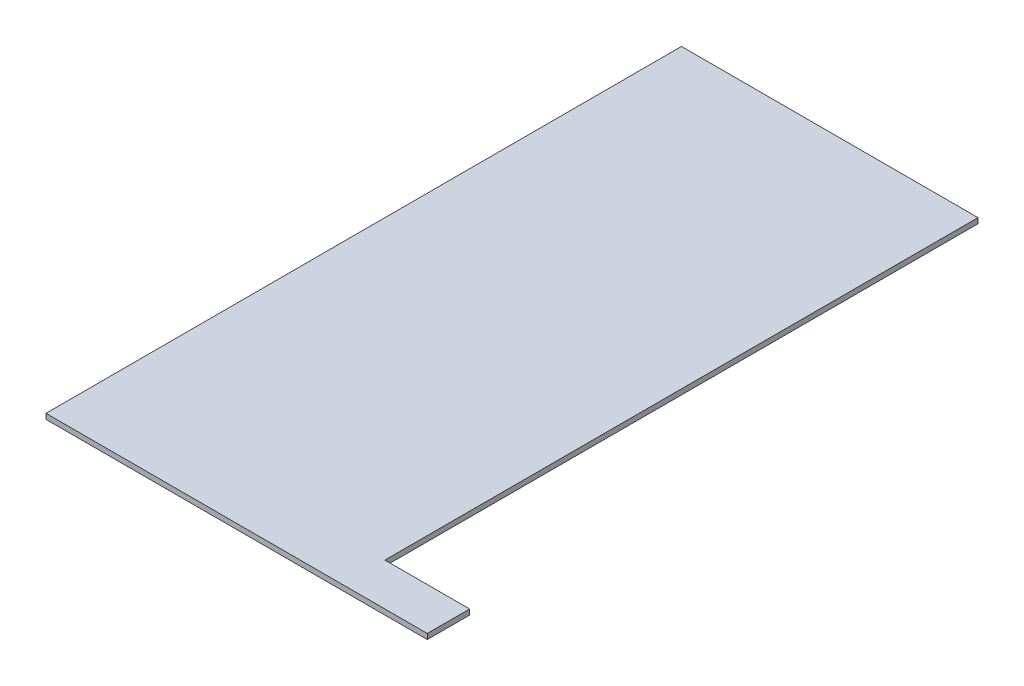
ISO-10303-21;
HEADER;
FILE_DESCRIPTION(('STEP AP214'),'2;1');
FILE_NAME('part.step','',(''),(''),'','','');
FILE_SCHEMA(('AUTOMOTIVE_DESIGN { 1 0 10303 214 1 1 1 1 }'));
ENDSEC;
DATA;
#1=APPLICATION_CONTEXT('core data for automotive mechanical design processes');
#2=APPLICATION_PROTOCOL_DEFINITION('international standard','automotive_design',2000,#1);
#3=PRODUCT_CONTEXT('',#1,'mechanical');
#4=PRODUCT('Part','Part','',(#3));
#5=PRODUCT_RELATED_PRODUCT_CATEGORY('part','',(#4));
#6=PRODUCT_DEFINITION_FORMATION('','',#4);
#7=PRODUCT_DEFINITION_CONTEXT('part definition',#1,'design');
#8=PRODUCT_DEFINITION('design','',#6,#7);
#9=PRODUCT_DEFINITION_SHAPE('','',#8);
#10=(LENGTH_UNIT() NAMED_UNIT(*) SI_UNIT(.MILLI.,.METRE.));
#11=(NAMED_UNIT(*) PLANE_ANGLE_UNIT() SI_UNIT($,.RADIAN.));
#12=(NAMED_UNIT(*) SI_UNIT($,.STERADIAN.) SOLID_ANGLE_UNIT());
#13=UNCERTAINTY_MEASURE_WITH_UNIT(LENGTH_MEASURE(1.E-05),#10,'distance_accuracy_value','');
#14=(GEOMETRIC_REPRESENTATION_CONTEXT(3) GLOBAL_UNCERTAINTY_ASSIGNED_CONTEXT((#13)) GLOBAL_UNIT_ASSIGNED_CONTEXT((#10,
#11,#12)) REPRESENTATION_CONTEXT('',''));
#15=CARTESIAN_POINT('',(0.,0.,0.));
#16=DIRECTION('',(0.,0.,1.));
#17=DIRECTION('',(1.,0.,0.));
#18=AXIS2_PLACEMENT_3D('',#15,#16,#17);
#19=CARTESIAN_POINT('',(44.45,1.5875,0.));
#20=DIRECTION('',(1.,0.,0.));
#21=DIRECTION('',(0.,0.,-1.));
#22=AXIS2_PLACEMENT_3D('',#19,#20,#21);
#23=PLANE('',#22);
#24=DIRECTION('',(0.,0.,1.));
#25=VECTOR('',#24,1.);
#26=CARTESIAN_POINT('',(44.45,0.,0.));
#27=LINE('',#26,#25);
#28=CARTESIAN_POINT('',(44.45,0.,-95.25));
#29=VERTEX_POINT('',#28);
#30=CARTESIAN_POINT('',(44.45,0.,82.55));
#31=VERTEX_POINT('',#30);
#32=EDGE_CURVE('E132',#29,#31,#27,.T.);
#33=ORIENTED_EDGE('',*,*,#32,.F.);
#34=DIRECTION('',(0.,-1.,0.));
#35=VECTOR('',#34,1.);
#36=CARTESIAN_POINT('',(44.45,1.5875,-95.25));
#37=LINE('',#36,#35);
#38=CARTESIAN_POINT('',(44.45,1.5875,-95.25));
#39=VERTEX_POINT('',#38);
#40=EDGE_CURVE('E11',#39,#29,#37,.T.);
#41=ORIENTED_EDGE('',*,*,#40,.F.);
#42=DIRECTION('',(0.,0.,1.));
#43=VECTOR('',#42,1.);
#44=CARTESIAN_POINT('',(44.45,1.5875,0.));
#45=LINE('',#44,#43);
#46=CARTESIAN_POINT('',(44.45,1.5875,82.55));
#47=VERTEX_POINT('',#46);
#48=EDGE_CURVE('E151',#39,#47,#45,.T.);
#49=ORIENTED_EDGE('',*,*,#48,.T.);
#50=DIRECTION('',(0.,-1.,0.));
#51=VECTOR('',#50,1.);
#52=CARTESIAN_POINT('',(44.45,1.5875,82.55));
#53=LINE('',#52,#51);
#54=EDGE_CURVE('E62',#47,#31,#53,.T.);
#55=ORIENTED_EDGE('',*,*,#54,.T.);
#56=EDGE_LOOP('',(#33,#41,#49,#55));
#57=FACE_BOUND('',#56,.T.);
#58=ADVANCED_FACE('F45',(#57),#23,.T.);
#59=CARTESIAN_POINT('',(0.,1.5875,-95.25));
#60=DIRECTION('',(0.,0.,-1.));
#61=DIRECTION('',(-1.,0.,0.));
#62=AXIS2_PLACEMENT_3D('',#59,#60,#61);
#63=PLANE('',#62);
#64=DIRECTION('',(1.,0.,0.));
#65=VECTOR('',#64,1.);
#66=CARTESIAN_POINT('',(0.,0.,-95.25));
#67=LINE('',#66,#65);
#68=CARTESIAN_POINT('',(-44.45,0.,-95.25));
#69=VERTEX_POINT('',#68);
#70=EDGE_CURVE('E135',#69,#29,#67,.T.);
#71=ORIENTED_EDGE('',*,*,#70,.F.);
#72=DIRECTION('',(0.,-1.,0.));
#73=VECTOR('',#72,1.);
#74=CARTESIAN_POINT('',(-44.45,1.5875,-95.25));
#75=LINE('',#74,#73);
#76=CARTESIAN_POINT('',(-44.45,1.5875,-95.25));
#77=VERTEX_POINT('',#76);
#78=EDGE_CURVE('E54',#77,#69,#75,.T.);
#79=ORIENTED_EDGE('',*,*,#78,.F.);
#80=DIRECTION('',(1.,0.,0.));
#81=VECTOR('',#80,1.);
#82=CARTESIAN_POINT('',(0.,1.5875,-95.25));
#83=LINE('',#82,#81);
#84=EDGE_CURVE('E167',#77,#39,#83,.T.);
#85=ORIENTED_EDGE('',*,*,#84,.T.);
#86=ORIENTED_EDGE('',*,*,#40,.T.);
#87=EDGE_LOOP('',(#71,#79,#85,#86));
#88=FACE_BOUND('',#87,.T.);
#89=ADVANCED_FACE('F166',(#88),#63,.T.);
#90=CARTESIAN_POINT('',(-44.45,1.5875,0.));
#91=DIRECTION('',(1.,0.,0.));
#92=DIRECTION('',(0.,0.,-1.));
#93=AXIS2_PLACEMENT_3D('',#90,#91,#92);
#94=PLANE('',#93);
#95=DIRECTION('',(0.,0.,1.));
#96=VECTOR('',#95,1.);
#97=CARTESIAN_POINT('',(-44.45,0.,0.));
#98=LINE('',#97,#96);
#99=CARTESIAN_POINT('',(-44.45,0.,95.25));
#100=VERTEX_POINT('',#99);
#101=EDGE_CURVE('E139',#69,#100,#98,.T.);
#102=ORIENTED_EDGE('',*,*,#101,.T.);
#103=DIRECTION('',(0.,-1.,0.));
#104=VECTOR('',#103,1.);
#105=CARTESIAN_POINT('',(-44.45,1.5875,95.25));
#106=LINE('',#105,#104);
#107=CARTESIAN_POINT('',(-44.45,1.5875,95.25));
#108=VERTEX_POINT('',#107);
#109=EDGE_CURVE('E122',#108,#100,#106,.T.);
#110=ORIENTED_EDGE('',*,*,#109,.F.);
#111=DIRECTION('',(0.,0.,1.));
#112=VECTOR('',#111,1.);
#113=CARTESIAN_POINT('',(-44.45,1.5875,0.));
#114=LINE('',#113,#112);
#115=EDGE_CURVE('E108',#77,#108,#114,.T.);
#116=ORIENTED_EDGE('',*,*,#115,.F.);
#117=ORIENTED_EDGE('',*,*,#78,.T.);
#118=EDGE_LOOP('',(#102,#110,#116,#117));
#119=FACE_BOUND('',#118,.T.);
#120=ADVANCED_FACE('F160',(#119),#94,.F.);
#121=CARTESIAN_POINT('',(0.,1.5875,95.25));
#122=DIRECTION('',(0.,0.,-1.));
#123=DIRECTION('',(-1.,0.,0.));
#124=AXIS2_PLACEMENT_3D('',#121,#122,#123);
#125=PLANE('',#124);
#126=DIRECTION('',(1.,0.,0.));
#127=VECTOR('',#126,1.);
#128=CARTESIAN_POINT('',(0.,0.,95.25));
#129=LINE('',#128,#127);
#130=CARTESIAN_POINT('',(69.85,0.,95.25));
#131=VERTEX_POINT('',#130);
#132=EDGE_CURVE('E118',#100,#131,#129,.T.);
#133=ORIENTED_EDGE('',*,*,#132,.T.);
#134=DIRECTION('',(0.,-1.,0.));
#135=VECTOR('',#134,1.);
#136=CARTESIAN_POINT('',(69.85,1.5875,95.25));
#137=LINE('',#136,#135);
#138=CARTESIAN_POINT('',(69.85,1.5875,95.25));
#139=VERTEX_POINT('',#138);
#140=EDGE_CURVE('E115',#139,#131,#137,.T.);
#141=ORIENTED_EDGE('',*,*,#140,.F.);
#142=DIRECTION('',(1.,0.,0.));
#143=VECTOR('',#142,1.);
#144=CARTESIAN_POINT('',(0.,1.5875,95.25));
#145=LINE('',#144,#143);
#146=EDGE_CURVE('E100',#108,#139,#145,.T.);
#147=ORIENTED_EDGE('',*,*,#146,.F.);
#148=ORIENTED_EDGE('',*,*,#109,.T.);
#149=EDGE_LOOP('',(#133,#141,#147,#148));
#150=FACE_BOUND('',#149,.T.);
#151=ADVANCED_FACE('F116',(#150),#125,.F.);
#152=CARTESIAN_POINT('',(69.8499999999999,1.5875,0.));
#153=DIRECTION('',(-1.,0.,0.));
#154=DIRECTION('',(0.,0.,1.));
#155=AXIS2_PLACEMENT_3D('',#152,#153,#154);
#156=PLANE('',#155);
#157=DIRECTION('',(0.,0.,-1.));
#158=VECTOR('',#157,1.);
#159=CARTESIAN_POINT('',(69.8499999999999,0.,0.));
#160=LINE('',#159,#158);
#161=CARTESIAN_POINT('',(69.85,0.,82.55));
#162=VERTEX_POINT('',#161);
#163=EDGE_CURVE('E144',#131,#162,#160,.T.);
#164=ORIENTED_EDGE('',*,*,#163,.T.);
#165=DIRECTION('',(0.,-1.,0.));
#166=VECTOR('',#165,1.);
#167=CARTESIAN_POINT('',(69.85,1.5875,82.55));
#168=LINE('',#167,#166);
#169=CARTESIAN_POINT('',(69.85,1.5875,82.55));
#170=VERTEX_POINT('',#169);
#171=EDGE_CURVE('E82',#170,#162,#168,.T.);
#172=ORIENTED_EDGE('',*,*,#171,.F.);
#173=DIRECTION('',(0.,0.,-1.));
#174=VECTOR('',#173,1.);
#175=CARTESIAN_POINT('',(69.8499999999999,1.5875,0.));
#176=LINE('',#175,#174);
#177=EDGE_CURVE('E105',#139,#170,#176,.T.);
#178=ORIENTED_EDGE('',*,*,#177,.F.);
#179=ORIENTED_EDGE('',*,*,#140,.T.);
#180=EDGE_LOOP('',(#164,#172,#178,#179));
#181=FACE_BOUND('',#180,.T.);
#182=ADVANCED_FACE('F124',(#181),#156,.F.);
#183=CARTESIAN_POINT('',(0.,1.5875,82.55));
#184=DIRECTION('',(0.,0.,-1.));
#185=DIRECTION('',(-1.,0.,0.));
#186=AXIS2_PLACEMENT_3D('',#183,#184,#185);
#187=PLANE('',#186);
#188=DIRECTION('',(1.,0.,0.));
#189=VECTOR('',#188,1.);
#190=CARTESIAN_POINT('',(0.,0.,82.55));
#191=LINE('',#190,#189);
#192=EDGE_CURVE('E147',#31,#162,#191,.T.);
#193=ORIENTED_EDGE('',*,*,#192,.F.);
#194=ORIENTED_EDGE('',*,*,#54,.F.);
#195=DIRECTION('',(1.,0.,0.));
#196=VECTOR('',#195,1.);
#197=CARTESIAN_POINT('',(0.,1.5875,82.55));
#198=LINE('',#197,#196);
#199=EDGE_CURVE('E126',#47,#170,#198,.T.);
#200=ORIENTED_EDGE('',*,*,#199,.T.);
#201=ORIENTED_EDGE('',*,*,#171,.T.);
#202=EDGE_LOOP('',(#193,#194,#200,#201));
#203=FACE_BOUND('',#202,.T.);
#204=ADVANCED_FACE('F168',(#203),#187,.T.);
#205=CARTESIAN_POINT('',(0.,1.5875,0.));
#206=DIRECTION('',(0.,1.,0.));
#207=DIRECTION('',(0.,0.,1.));
#208=AXIS2_PLACEMENT_3D('',#205,#206,#207);
#209=PLANE('',#208);
#210=ORIENTED_EDGE('',*,*,#48,.F.);
#211=ORIENTED_EDGE('',*,*,#84,.F.);
#212=ORIENTED_EDGE('',*,*,#115,.T.);
#213=ORIENTED_EDGE('',*,*,#146,.T.);
#214=ORIENTED_EDGE('',*,*,#177,.T.);
#215=ORIENTED_EDGE('',*,*,#199,.F.);
#216=EDGE_LOOP('',(#210,#211,#212,#213,#214,#215));
#217=FACE_BOUND('',#216,.T.);
#218=ADVANCED_FACE('F102',(#217),#209,.T.);
#219=CARTESIAN_POINT('',(0.,0.,0.));
#220=DIRECTION('',(0.,1.,0.));
#221=DIRECTION('',(0.,0.,1.));
#222=AXIS2_PLACEMENT_3D('',#219,#220,#221);
#223=PLANE('',#222);
#224=ORIENTED_EDGE('',*,*,#32,.T.);
#225=ORIENTED_EDGE('',*,*,#192,.T.);
#226=ORIENTED_EDGE('',*,*,#163,.F.);
#227=ORIENTED_EDGE('',*,*,#132,.F.);
#228=ORIENTED_EDGE('',*,*,#101,.F.);
#229=ORIENTED_EDGE('',*,*,#70,.T.);
#230=EDGE_LOOP('',(#224,#225,#226,#227,#228,#229));
#231=FACE_BOUND('',#230,.T.);
#232=ADVANCED_FACE('F165',(#231),#223,.F.);
#233=CLOSED_SHELL('',(#58,#89,#120,#151,#182,#204,#218,#232));
#234=MANIFOLD_SOLID_BREP('B2',#233);
#235=ADVANCED_BREP_SHAPE_REPRESENTATION('',(#18,#234),#14);
#236=SHAPE_DEFINITION_REPRESENTATION(#9,#235);
ENDSEC;
END-ISO-10303-21;
